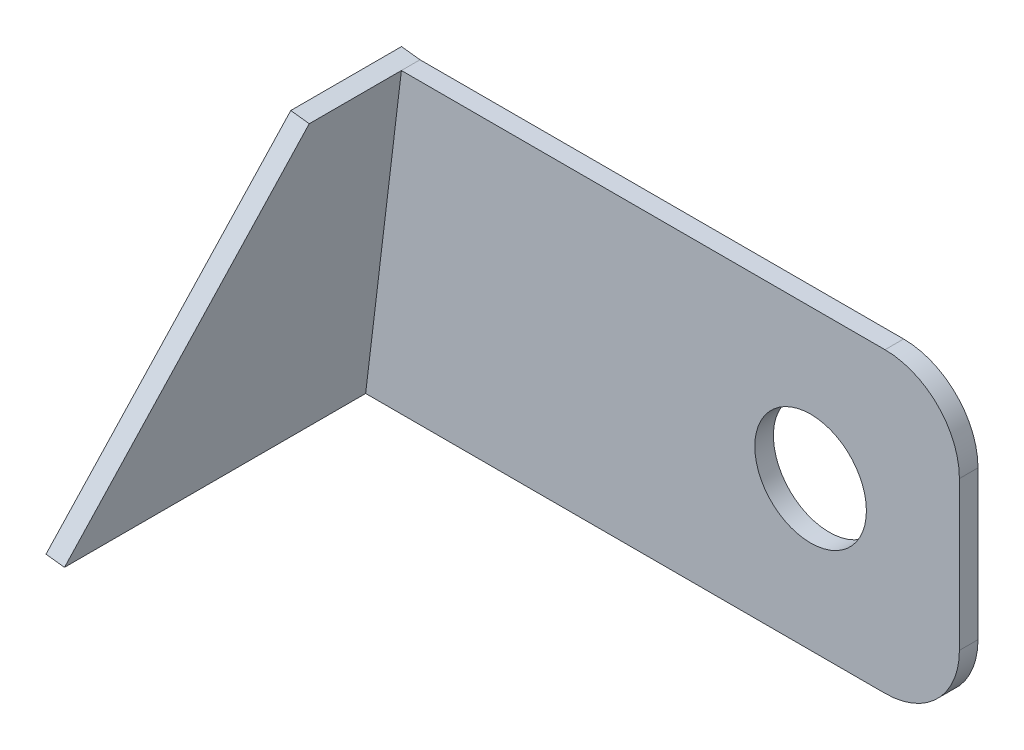
ISO-10303-21;
HEADER;
FILE_DESCRIPTION(('STEP AP214'),'2;1');
FILE_NAME('part.step','',(''),(''),'','','');
FILE_SCHEMA(('AUTOMOTIVE_DESIGN { 1 0 10303 214 1 1 1 1 }'));
ENDSEC;
DATA;
#1=APPLICATION_CONTEXT('core data for automotive mechanical design processes');
#2=APPLICATION_PROTOCOL_DEFINITION('international standard','automotive_design',2000,#1);
#3=PRODUCT_CONTEXT('',#1,'mechanical');
#4=PRODUCT('Part','Part','',(#3));
#5=PRODUCT_RELATED_PRODUCT_CATEGORY('part','',(#4));
#6=PRODUCT_DEFINITION_FORMATION('','',#4);
#7=PRODUCT_DEFINITION_CONTEXT('part definition',#1,'design');
#8=PRODUCT_DEFINITION('design','',#6,#7);
#9=PRODUCT_DEFINITION_SHAPE('','',#8);
#10=(LENGTH_UNIT() NAMED_UNIT(*) SI_UNIT(.MILLI.,.METRE.));
#11=(NAMED_UNIT(*) PLANE_ANGLE_UNIT() SI_UNIT($,.RADIAN.));
#12=(NAMED_UNIT(*) SI_UNIT($,.STERADIAN.) SOLID_ANGLE_UNIT());
#13=UNCERTAINTY_MEASURE_WITH_UNIT(LENGTH_MEASURE(1.E-05),#10,'distance_accuracy_value','');
#14=(GEOMETRIC_REPRESENTATION_CONTEXT(3) GLOBAL_UNCERTAINTY_ASSIGNED_CONTEXT((#13)) GLOBAL_UNIT_ASSIGNED_CONTEXT((#10,
#11,#12)) REPRESENTATION_CONTEXT('',''));
#15=CARTESIAN_POINT('',(0.,0.,0.));
#16=DIRECTION('',(0.,0.,1.));
#17=DIRECTION('',(1.,0.,0.));
#18=AXIS2_PLACEMENT_3D('',#15,#16,#17);
#19=CARTESIAN_POINT('',(0.,12.7,1.5875));
#20=DIRECTION('',(0.,-1.,0.));
#21=DIRECTION('',(0.,0.,-1.));
#22=AXIS2_PLACEMENT_3D('',#19,#20,#21);
#23=PLANE('',#22);
#24=DIRECTION('',(-1.,0.,0.));
#25=VECTOR('',#24,1.);
#26=CARTESIAN_POINT('',(0.,12.7,1.5875));
#27=LINE('',#26,#25);
#28=CARTESIAN_POINT('',(41.275,12.7,1.5875));
#29=VERTEX_POINT('',#28);
#30=CARTESIAN_POINT('',(0.,12.7,1.5875));
#31=VERTEX_POINT('',#30);
#32=EDGE_CURVE('E154',#29,#31,#27,.T.);
#33=ORIENTED_EDGE('',*,*,#32,.F.);
#34=DIRECTION('',(0.,0.,-1.));
#35=VECTOR('',#34,1.);
#36=CARTESIAN_POINT('',(41.275,12.7,1.5875));
#37=LINE('',#36,#35);
#38=CARTESIAN_POINT('',(41.275,12.7,0.));
#39=VERTEX_POINT('',#38);
#40=EDGE_CURVE('E11',#29,#39,#37,.T.);
#41=ORIENTED_EDGE('',*,*,#40,.T.);
#42=DIRECTION('',(-1.,0.,0.));
#43=VECTOR('',#42,1.);
#44=CARTESIAN_POINT('',(0.,12.7,0.));
#45=LINE('',#44,#43);
#46=CARTESIAN_POINT('',(0.,12.7,0.));
#47=VERTEX_POINT('',#46);
#48=EDGE_CURVE('E153',#39,#47,#45,.T.);
#49=ORIENTED_EDGE('',*,*,#48,.T.);
#50=DIRECTION('',(0.,0.,-1.));
#51=VECTOR('',#50,1.);
#52=CARTESIAN_POINT('',(0.,12.7,1.5875));
#53=LINE('',#52,#51);
#54=EDGE_CURVE('E141',#31,#47,#53,.T.);
#55=ORIENTED_EDGE('',*,*,#54,.F.);
#56=EDGE_LOOP('',(#33,#41,#49,#55));
#57=FACE_BOUND('',#56,.T.);
#58=ADVANCED_FACE('F39',(#57),#23,.F.);
#59=CARTESIAN_POINT('',(0.,-12.7,1.5875));
#60=DIRECTION('',(0.,1.,0.));
#61=DIRECTION('',(0.,0.,1.));
#62=AXIS2_PLACEMENT_3D('',#59,#60,#61);
#63=PLANE('',#62);
#64=DIRECTION('',(1.,0.,0.));
#65=VECTOR('',#64,1.);
#66=CARTESIAN_POINT('',(0.,-12.7,0.));
#67=LINE('',#66,#65);
#68=CARTESIAN_POINT('',(-3.05124982636702,-12.7,0.));
#69=VERTEX_POINT('',#68);
#70=CARTESIAN_POINT('',(41.275,-12.7,0.));
#71=VERTEX_POINT('',#70);
#72=EDGE_CURVE('E165',#69,#71,#67,.T.);
#73=ORIENTED_EDGE('',*,*,#72,.T.);
#74=DIRECTION('',(0.,0.,-1.));
#75=VECTOR('',#74,1.);
#76=CARTESIAN_POINT('',(41.275,-12.7,1.5875));
#77=LINE('',#76,#75);
#78=CARTESIAN_POINT('',(41.275,-12.7,1.5875));
#79=VERTEX_POINT('',#78);
#80=EDGE_CURVE('E62',#71,#79,#77,.F.);
#81=ORIENTED_EDGE('',*,*,#80,.T.);
#82=DIRECTION('',(1.,0.,0.));
#83=VECTOR('',#82,1.);
#84=CARTESIAN_POINT('',(-3.05124982636702,-12.7,1.5875));
#85=LINE('',#84,#83);
#86=CARTESIAN_POINT('',(-3.05124982636702,-12.7,1.5875));
#87=VERTEX_POINT('',#86);
#88=EDGE_CURVE('E159',#87,#79,#85,.T.);
#89=ORIENTED_EDGE('',*,*,#88,.F.);
#90=DIRECTION('',(0.,0.,-1.));
#91=VECTOR('',#90,1.);
#92=CARTESIAN_POINT('',(-3.05124982636702,-12.7,1.5875));
#93=LINE('',#92,#91);
#94=EDGE_CURVE('E163',#87,#69,#93,.T.);
#95=ORIENTED_EDGE('',*,*,#94,.T.);
#96=EDGE_LOOP('',(#73,#81,#89,#95));
#97=FACE_BOUND('',#96,.T.);
#98=ADVANCED_FACE('F190',(#97),#63,.F.);
#99=CARTESIAN_POINT('',(47.625,12.7,1.5875));
#100=DIRECTION('',(-1.,0.,0.));
#101=DIRECTION('',(0.,0.,1.));
#102=AXIS2_PLACEMENT_3D('',#99,#100,#101);
#103=PLANE('',#102);
#104=DIRECTION('',(0.,1.,0.));
#105=VECTOR('',#104,1.);
#106=CARTESIAN_POINT('',(47.625,12.7,1.5875));
#107=LINE('',#106,#105);
#108=CARTESIAN_POINT('',(47.625,-6.35,1.5875));
#109=VERTEX_POINT('',#108);
#110=CARTESIAN_POINT('',(47.625,6.35,1.5875));
#111=VERTEX_POINT('',#110);
#112=EDGE_CURVE('E161',#109,#111,#107,.T.);
#113=ORIENTED_EDGE('',*,*,#112,.F.);
#114=DIRECTION('',(0.,0.,-1.));
#115=VECTOR('',#114,1.);
#116=CARTESIAN_POINT('',(47.625,-6.35,1.5875));
#117=LINE('',#116,#115);
#118=CARTESIAN_POINT('',(47.625,-6.35,0.));
#119=VERTEX_POINT('',#118);
#120=EDGE_CURVE('E173',#109,#119,#117,.T.);
#121=ORIENTED_EDGE('',*,*,#120,.T.);
#122=DIRECTION('',(0.,1.,0.));
#123=VECTOR('',#122,1.);
#124=CARTESIAN_POINT('',(47.625,12.7,0.));
#125=LINE('',#124,#123);
#126=CARTESIAN_POINT('',(47.625,6.35,0.));
#127=VERTEX_POINT('',#126);
#128=EDGE_CURVE('E157',#119,#127,#125,.T.);
#129=ORIENTED_EDGE('',*,*,#128,.T.);
#130=DIRECTION('',(0.,0.,-1.));
#131=VECTOR('',#130,1.);
#132=CARTESIAN_POINT('',(47.625,6.35,1.5875));
#133=LINE('',#132,#131);
#134=EDGE_CURVE('E171',#127,#111,#133,.F.);
#135=ORIENTED_EDGE('',*,*,#134,.T.);
#136=EDGE_LOOP('',(#113,#121,#129,#135));
#137=FACE_BOUND('',#136,.T.);
#138=ADVANCED_FACE('F187',(#137),#103,.F.);
#139=CARTESIAN_POINT('',(0.,0.,1.5875));
#140=DIRECTION('',(0.,0.,-1.));
#141=DIRECTION('',(-1.,0.,0.));
#142=AXIS2_PLACEMENT_3D('',#139,#140,#141);
#143=PLANE('',#142);
#144=CARTESIAN_POINT('',(34.925,0.,1.5875));
#145=DIRECTION('',(0.,0.,-1.));
#146=DIRECTION('',(-1.,0.,0.));
#147=AXIS2_PLACEMENT_3D('',#144,#145,#146);
#148=CIRCLE('',#147,4.7625);
#149=CARTESIAN_POINT('',(30.1625,0.,1.5875));
#150=VERTEX_POINT('',#149);
#151=EDGE_CURVE('E145',#150,#150,#148,.T.);
#152=ORIENTED_EDGE('',*,*,#151,.T.);
#153=EDGE_LOOP('',(#152));
#154=FACE_BOUND('',#153,.T.);
#155=ORIENTED_EDGE('',*,*,#88,.T.);
#156=CARTESIAN_POINT('',(41.275,-6.35,1.5875));
#157=DIRECTION('',(0.,0.,-1.));
#158=DIRECTION('',(-1.,0.,0.));
#159=AXIS2_PLACEMENT_3D('',#156,#157,#158);
#160=CIRCLE('',#159,6.35);
#161=EDGE_CURVE('E47',#79,#109,#160,.F.);
#162=ORIENTED_EDGE('',*,*,#161,.T.);
#163=ORIENTED_EDGE('',*,*,#112,.T.);
#164=CARTESIAN_POINT('',(41.275,6.35,1.5875));
#165=DIRECTION('',(0.,0.,-1.));
#166=DIRECTION('',(-1.,0.,0.));
#167=AXIS2_PLACEMENT_3D('',#164,#165,#166);
#168=CIRCLE('',#167,6.35);
#169=EDGE_CURVE('E54',#111,#29,#168,.F.);
#170=ORIENTED_EDGE('',*,*,#169,.T.);
#171=ORIENTED_EDGE('',*,*,#32,.T.);
#172=DIRECTION('',(-0.119270448985395,-0.992861803071718,0.));
#173=VECTOR('',#172,1.);
#174=CARTESIAN_POINT('',(0.,12.7,1.5875));
#175=LINE('',#174,#173);
#176=EDGE_CURVE('E156',#31,#87,#175,.T.);
#177=ORIENTED_EDGE('',*,*,#176,.T.);
#178=EDGE_LOOP('',(#155,#162,#163,#170,#171,#177));
#179=FACE_BOUND('',#178,.T.);
#180=ADVANCED_FACE('F183',(#154,#179),#143,.F.);
#181=CARTESIAN_POINT('',(0.,0.,0.));
#182=DIRECTION('',(0.,0.,-1.));
#183=DIRECTION('',(-1.,0.,0.));
#184=AXIS2_PLACEMENT_3D('',#181,#182,#183);
#185=PLANE('',#184);
#186=CARTESIAN_POINT('',(34.925,0.,0.));
#187=DIRECTION('',(0.,0.,1.));
#188=DIRECTION('',(1.,0.,0.));
#189=AXIS2_PLACEMENT_3D('',#186,#187,#188);
#190=CIRCLE('',#189,4.7625);
#191=CARTESIAN_POINT('',(39.6875,0.,0.));
#192=VERTEX_POINT('',#191);
#193=EDGE_CURVE('E142',#192,#192,#190,.T.);
#194=ORIENTED_EDGE('',*,*,#193,.T.);
#195=EDGE_LOOP('',(#194));
#196=FACE_BOUND('',#195,.T.);
#197=ORIENTED_EDGE('',*,*,#128,.F.);
#198=CARTESIAN_POINT('',(41.275,-6.35,0.));
#199=DIRECTION('',(0.,0.,-1.));
#200=DIRECTION('',(-1.,0.,0.));
#201=AXIS2_PLACEMENT_3D('',#198,#199,#200);
#202=CIRCLE('',#201,6.35);
#203=EDGE_CURVE('E178',#119,#71,#202,.T.);
#204=ORIENTED_EDGE('',*,*,#203,.T.);
#205=ORIENTED_EDGE('',*,*,#72,.F.);
#206=DIRECTION('',(0.992861803071718,-0.119270448985395,0.));
#207=VECTOR('',#206,1.);
#208=CARTESIAN_POINT('',(-4.62741793874337,-12.5106581622357,0.));
#209=LINE('',#208,#207);
#210=CARTESIAN_POINT('',(-4.62741793874337,-12.5106581622357,0.));
#211=VERTEX_POINT('',#210);
#212=EDGE_CURVE('E122',#211,#69,#209,.T.);
#213=ORIENTED_EDGE('',*,*,#212,.F.);
#214=DIRECTION('',(-0.119270448985395,-0.992861803071718,0.));
#215=VECTOR('',#214,1.);
#216=CARTESIAN_POINT('',(-1.57616811237635,12.8893418377643,0.));
#217=LINE('',#216,#215);
#218=CARTESIAN_POINT('',(-1.57616811237635,12.8893418377643,0.));
#219=VERTEX_POINT('',#218);
#220=EDGE_CURVE('E113',#219,#211,#217,.T.);
#221=ORIENTED_EDGE('',*,*,#220,.F.);
#222=DIRECTION('',(0.992861803071718,-0.119270448985395,0.));
#223=VECTOR('',#222,1.);
#224=CARTESIAN_POINT('',(-1.57616811237635,12.8893418377643,0.));
#225=LINE('',#224,#223);
#226=EDGE_CURVE('E119',#219,#47,#225,.T.);
#227=ORIENTED_EDGE('',*,*,#226,.T.);
#228=ORIENTED_EDGE('',*,*,#48,.F.);
#229=CARTESIAN_POINT('',(41.275,6.35,0.));
#230=DIRECTION('',(0.,0.,-1.));
#231=DIRECTION('',(-1.,0.,0.));
#232=AXIS2_PLACEMENT_3D('',#229,#230,#231);
#233=CIRCLE('',#232,6.35);
#234=EDGE_CURVE('E176',#39,#127,#233,.T.);
#235=ORIENTED_EDGE('',*,*,#234,.T.);
#236=EDGE_LOOP('',(#197,#204,#205,#213,#221,#227,#228,#235));
#237=FACE_BOUND('',#236,.T.);
#238=ADVANCED_FACE('F116',(#196,#237),#185,.T.);
#239=CARTESIAN_POINT('',(34.925,0.,0.));
#240=DIRECTION('',(0.,0.,1.));
#241=DIRECTION('',(1.,0.,0.));
#242=AXIS2_PLACEMENT_3D('',#239,#240,#241);
#243=CYLINDRICAL_SURFACE('',#242,4.7625);
#244=ORIENTED_EDGE('',*,*,#193,.F.);
#245=EDGE_LOOP('',(#244));
#246=FACE_BOUND('',#245,.T.);
#247=ORIENTED_EDGE('',*,*,#151,.F.);
#248=EDGE_LOOP('',(#247));
#249=FACE_BOUND('',#248,.T.);
#250=ADVANCED_FACE('F232',(#246,#249),#243,.F.);
#251=CARTESIAN_POINT('',(-1.50392222751671,0.180663088014956,0.));
#252=DIRECTION('',(0.992861803071718,-0.119270448985395,0.));
#253=DIRECTION('',(0.119270448985395,0.992861803071718,0.));
#254=AXIS2_PLACEMENT_3D('',#251,#252,#253);
#255=PLANE('',#254);
#256=ORIENTED_EDGE('',*,*,#176,.F.);
#257=DIRECTION('',(0.,0.,-1.));
#258=VECTOR('',#257,1.);
#259=CARTESIAN_POINT('',(0.,12.7,0.));
#260=LINE('',#259,#258);
#261=CARTESIAN_POINT('',(0.,12.7,9.45379103861392));
#262=VERTEX_POINT('',#261);
#263=EDGE_CURVE('E202',#262,#31,#260,.T.);
#264=ORIENTED_EDGE('',*,*,#263,.F.);
#265=DIRECTION('',(0.0978291419740346,0.81437455060803,-0.572034570898117));
#266=VECTOR('',#265,1.);
#267=CARTESIAN_POINT('',(0.,12.7,9.45379103861392));
#268=LINE('',#267,#266);
#269=CARTESIAN_POINT('',(-3.05124982636702,-12.7,27.2953089126241));
#270=VERTEX_POINT('',#269);
#271=EDGE_CURVE('E135',#270,#262,#268,.T.);
#272=ORIENTED_EDGE('',*,*,#271,.F.);
#273=DIRECTION('',(0.,0.,1.));
#274=VECTOR('',#273,1.);
#275=CARTESIAN_POINT('',(-3.05124982636702,-12.7,0.));
#276=LINE('',#275,#274);
#277=EDGE_CURVE('E196',#87,#270,#276,.T.);
#278=ORIENTED_EDGE('',*,*,#277,.F.);
#279=EDGE_LOOP('',(#256,#264,#272,#278));
#280=FACE_BOUND('',#279,.T.);
#281=ADVANCED_FACE('F212',(#280),#255,.T.);
#282=CARTESIAN_POINT('',(-1.57616811237635,12.8893418377643,0.));
#283=DIRECTION('',(-0.119270448985395,-0.992861803071718,0.));
#284=DIRECTION('',(0.992861803071718,-0.119270448985395,0.));
#285=AXIS2_PLACEMENT_3D('',#282,#283,#284);
#286=PLANE('',#285);
#287=ORIENTED_EDGE('',*,*,#263,.T.);
#288=ORIENTED_EDGE('',*,*,#54,.T.);
#289=ORIENTED_EDGE('',*,*,#226,.F.);
#290=DIRECTION('',(0.,0.,-1.));
#291=VECTOR('',#290,1.);
#292=CARTESIAN_POINT('',(-1.57616811237635,12.8893418377643,0.));
#293=LINE('',#292,#291);
#294=CARTESIAN_POINT('',(-1.57616811237635,12.8893418377643,9.45379103861392));
#295=VERTEX_POINT('',#294);
#296=EDGE_CURVE('E126',#295,#219,#293,.T.);
#297=ORIENTED_EDGE('',*,*,#296,.F.);
#298=DIRECTION('',(0.992861803071718,-0.119270448985395,0.));
#299=VECTOR('',#298,1.);
#300=CARTESIAN_POINT('',(-1.57616811237635,12.8893418377643,9.45379103861392));
#301=LINE('',#300,#299);
#302=EDGE_CURVE('E199',#295,#262,#301,.T.);
#303=ORIENTED_EDGE('',*,*,#302,.T.);
#304=EDGE_LOOP('',(#287,#288,#289,#297,#303));
#305=FACE_BOUND('',#304,.T.);
#306=ADVANCED_FACE('F139',(#305),#286,.F.);
#307=CARTESIAN_POINT('',(-4.62741793874337,-12.5106581622357,0.));
#308=DIRECTION('',(0.119270448985395,0.992861803071718,0.));
#309=DIRECTION('',(-0.992861803071718,0.119270448985395,0.));
#310=AXIS2_PLACEMENT_3D('',#307,#308,#309);
#311=PLANE('',#310);
#312=ORIENTED_EDGE('',*,*,#94,.F.);
#313=ORIENTED_EDGE('',*,*,#277,.T.);
#314=DIRECTION('',(0.992861803071718,-0.119270448985395,0.));
#315=VECTOR('',#314,1.);
#316=CARTESIAN_POINT('',(-4.62741793874337,-12.5106581622357,27.2953089126241));
#317=LINE('',#316,#315);
#318=CARTESIAN_POINT('',(-4.62741793874337,-12.5106581622357,27.2953089126241));
#319=VERTEX_POINT('',#318);
#320=EDGE_CURVE('E147',#319,#270,#317,.T.);
#321=ORIENTED_EDGE('',*,*,#320,.F.);
#322=DIRECTION('',(0.,0.,1.));
#323=VECTOR('',#322,1.);
#324=CARTESIAN_POINT('',(-4.62741793874337,-12.5106581622357,0.));
#325=LINE('',#324,#323);
#326=EDGE_CURVE('E125',#211,#319,#325,.T.);
#327=ORIENTED_EDGE('',*,*,#326,.F.);
#328=ORIENTED_EDGE('',*,*,#212,.T.);
#329=EDGE_LOOP('',(#312,#313,#321,#327,#328));
#330=FACE_BOUND('',#329,.T.);
#331=ADVANCED_FACE('F194',(#330),#311,.F.);
#332=CARTESIAN_POINT('',(-1.57616811237635,12.8893418377643,9.45379103861392));
#333=DIRECTION('',(-0.0682268201061862,-0.567951275481261,-0.820229510379508));
#334=DIRECTION('',(0.,0.822145243895806,-0.569277786269151));
#335=AXIS2_PLACEMENT_3D('',#332,#333,#334);
#336=PLANE('',#335);
#337=ORIENTED_EDGE('',*,*,#271,.T.);
#338=ORIENTED_EDGE('',*,*,#302,.F.);
#339=DIRECTION('',(0.0978291419740346,0.81437455060803,-0.572034570898117));
#340=VECTOR('',#339,1.);
#341=CARTESIAN_POINT('',(-1.57616811237635,12.8893418377643,9.45379103861392));
#342=LINE('',#341,#340);
#343=EDGE_CURVE('E131',#319,#295,#342,.T.);
#344=ORIENTED_EDGE('',*,*,#343,.F.);
#345=ORIENTED_EDGE('',*,*,#320,.T.);
#346=EDGE_LOOP('',(#337,#338,#344,#345));
#347=FACE_BOUND('',#346,.T.);
#348=ADVANCED_FACE('F208',(#347),#336,.F.);
#349=CARTESIAN_POINT('',(-3.08009033989307,0.370004925779271,0.));
#350=DIRECTION('',(0.992861803071718,-0.119270448985395,0.));
#351=DIRECTION('',(0.119270448985395,0.992861803071718,0.));
#352=AXIS2_PLACEMENT_3D('',#349,#350,#351);
#353=PLANE('',#352);
#354=ORIENTED_EDGE('',*,*,#296,.T.);
#355=ORIENTED_EDGE('',*,*,#220,.T.);
#356=ORIENTED_EDGE('',*,*,#326,.T.);
#357=ORIENTED_EDGE('',*,*,#343,.T.);
#358=EDGE_LOOP('',(#354,#355,#356,#357));
#359=FACE_BOUND('',#358,.T.);
#360=ADVANCED_FACE('F129',(#359),#353,.F.);
#361=CARTESIAN_POINT('',(41.275,-6.35,1.5875));
#362=DIRECTION('',(0.,0.,-1.));
#363=DIRECTION('',(-1.,0.,0.));
#364=AXIS2_PLACEMENT_3D('',#361,#362,#363);
#365=CYLINDRICAL_SURFACE('',#364,6.35);
#366=ORIENTED_EDGE('',*,*,#161,.F.);
#367=ORIENTED_EDGE('',*,*,#80,.F.);
#368=ORIENTED_EDGE('',*,*,#203,.F.);
#369=ORIENTED_EDGE('',*,*,#120,.F.);
#370=EDGE_LOOP('',(#366,#367,#368,#369));
#371=FACE_BOUND('',#370,.T.);
#372=ADVANCED_FACE('F189',(#371),#365,.T.);
#373=CARTESIAN_POINT('',(41.275,6.35,1.5875));
#374=DIRECTION('',(0.,0.,-1.));
#375=DIRECTION('',(-1.,0.,0.));
#376=AXIS2_PLACEMENT_3D('',#373,#374,#375);
#377=CYLINDRICAL_SURFACE('',#376,6.35);
#378=ORIENTED_EDGE('',*,*,#169,.F.);
#379=ORIENTED_EDGE('',*,*,#134,.F.);
#380=ORIENTED_EDGE('',*,*,#234,.F.);
#381=ORIENTED_EDGE('',*,*,#40,.F.);
#382=EDGE_LOOP('',(#378,#379,#380,#381));
#383=FACE_BOUND('',#382,.T.);
#384=ADVANCED_FACE('F41',(#383),#377,.T.);
#385=CLOSED_SHELL('',(#58,#98,#138,#180,#238,#250,#281,#306,#331,#348,#360,#372,#384));
#386=MANIFOLD_SOLID_BREP('B2',#385);
#387=ADVANCED_BREP_SHAPE_REPRESENTATION('',(#18,#386),#14);
#388=SHAPE_DEFINITION_REPRESENTATION(#9,#387);
ENDSEC;
END-ISO-10303-21;
